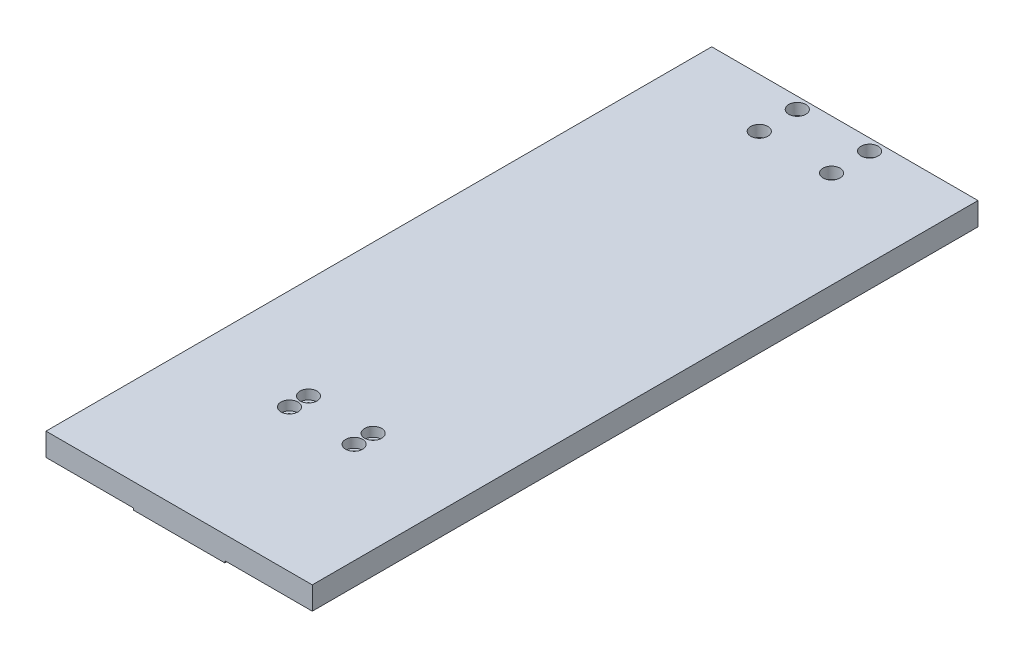
ISO-10303-21;
HEADER;
FILE_DESCRIPTION(('STEP AP214'),'2;1');
FILE_NAME('part.step','',(''),(''),'','','');
FILE_SCHEMA(('AUTOMOTIVE_DESIGN { 1 0 10303 214 1 1 1 1 }'));
ENDSEC;
DATA;
#1=APPLICATION_CONTEXT('core data for automotive mechanical design processes');
#2=APPLICATION_PROTOCOL_DEFINITION('international standard','automotive_design',2000,#1);
#3=PRODUCT_CONTEXT('',#1,'mechanical');
#4=PRODUCT('Part','Part','',(#3));
#5=PRODUCT_RELATED_PRODUCT_CATEGORY('part','',(#4));
#6=PRODUCT_DEFINITION_FORMATION('','',#4);
#7=PRODUCT_DEFINITION_CONTEXT('part definition',#1,'design');
#8=PRODUCT_DEFINITION('design','',#6,#7);
#9=PRODUCT_DEFINITION_SHAPE('','',#8);
#10=(LENGTH_UNIT() NAMED_UNIT(*) SI_UNIT(.MILLI.,.METRE.));
#11=(NAMED_UNIT(*) PLANE_ANGLE_UNIT() SI_UNIT($,.RADIAN.));
#12=(NAMED_UNIT(*) SI_UNIT($,.STERADIAN.) SOLID_ANGLE_UNIT());
#13=UNCERTAINTY_MEASURE_WITH_UNIT(LENGTH_MEASURE(1.E-05),#10,'distance_accuracy_value','');
#14=(GEOMETRIC_REPRESENTATION_CONTEXT(3) GLOBAL_UNCERTAINTY_ASSIGNED_CONTEXT((#13)) GLOBAL_UNIT_ASSIGNED_CONTEXT((#10,
#11,#12)) REPRESENTATION_CONTEXT('',''));
#15=CARTESIAN_POINT('',(0.,0.,0.));
#16=DIRECTION('',(0.,0.,1.));
#17=DIRECTION('',(1.,0.,0.));
#18=AXIS2_PLACEMENT_3D('',#15,#16,#17);
#19=CARTESIAN_POINT('',(0.,13.,-350.));
#20=DIRECTION('',(0.,0.,1.));
#21=DIRECTION('',(1.,0.,0.));
#22=AXIS2_PLACEMENT_3D('',#19,#20,#21);
#23=PLANE('',#22);
#24=CARTESIAN_POINT('',(9.99999999999999,6.99999999999999,-350.));
#25=DIRECTION('',(0.,0.,-1.));
#26=DIRECTION('',(-1.,0.,0.));
#27=AXIS2_PLACEMENT_3D('',#24,#25,#26);
#28=CIRCLE('',#27,2.09999999999999);
#29=CARTESIAN_POINT('',(7.9,6.99999999999999,-350.));
#30=VERTEX_POINT('',#29);
#31=EDGE_CURVE('E326',#30,#30,#28,.T.);
#32=ORIENTED_EDGE('',*,*,#31,.F.);
#33=EDGE_LOOP('',(#32));
#34=FACE_BOUND('',#33,.T.);
#35=CARTESIAN_POINT('',(35.,6.99999999999999,-350.));
#36=DIRECTION('',(0.,0.,-1.));
#37=DIRECTION('',(-1.,0.,0.));
#38=AXIS2_PLACEMENT_3D('',#35,#36,#37);
#39=CIRCLE('',#38,2.09999999999999);
#40=CARTESIAN_POINT('',(32.9,6.99999999999999,-350.));
#41=VERTEX_POINT('',#40);
#42=EDGE_CURVE('E320',#41,#41,#39,.T.);
#43=ORIENTED_EDGE('',*,*,#42,.F.);
#44=EDGE_LOOP('',(#43));
#45=FACE_BOUND('',#44,.T.);
#46=CARTESIAN_POINT('',(105.,6.99999999999999,-350.));
#47=DIRECTION('',(0.,0.,-1.));
#48=DIRECTION('',(-1.,0.,0.));
#49=AXIS2_PLACEMENT_3D('',#46,#47,#48);
#50=CIRCLE('',#49,2.09999999999999);
#51=CARTESIAN_POINT('',(102.9,6.99999999999999,-350.));
#52=VERTEX_POINT('',#51);
#53=EDGE_CURVE('E314',#52,#52,#50,.T.);
#54=ORIENTED_EDGE('',*,*,#53,.F.);
#55=EDGE_LOOP('',(#54));
#56=FACE_BOUND('',#55,.T.);
#57=CARTESIAN_POINT('',(130.,6.99999999999998,-350.));
#58=DIRECTION('',(0.,0.,-1.));
#59=DIRECTION('',(-1.,0.,0.));
#60=AXIS2_PLACEMENT_3D('',#57,#58,#59);
#61=CIRCLE('',#60,2.09999999999999);
#62=CARTESIAN_POINT('',(127.9,6.99999999999998,-350.));
#63=VERTEX_POINT('',#62);
#64=EDGE_CURVE('E301',#63,#63,#61,.T.);
#65=ORIENTED_EDGE('',*,*,#64,.F.);
#66=EDGE_LOOP('',(#65));
#67=FACE_BOUND('',#66,.T.);
#68=DIRECTION('',(0.,-1.,0.));
#69=VECTOR('',#68,1.);
#70=CARTESIAN_POINT('',(140.,13.,-350.));
#71=LINE('',#70,#69);
#72=CARTESIAN_POINT('',(140.,13.,-350.));
#73=VERTEX_POINT('',#72);
#74=CARTESIAN_POINT('',(140.,1.,-350.));
#75=VERTEX_POINT('',#74);
#76=EDGE_CURVE('E197',#73,#75,#71,.T.);
#77=ORIENTED_EDGE('',*,*,#76,.T.);
#78=DIRECTION('',(1.,0.,0.));
#79=VECTOR('',#78,1.);
#80=CARTESIAN_POINT('',(0.,1.,-350.));
#81=LINE('',#80,#79);
#82=CARTESIAN_POINT('',(0.,1.,-350.));
#83=VERTEX_POINT('',#82);
#84=EDGE_CURVE('E170',#83,#75,#81,.T.);
#85=ORIENTED_EDGE('',*,*,#84,.F.);
#86=DIRECTION('',(0.,-1.,0.));
#87=VECTOR('',#86,1.);
#88=CARTESIAN_POINT('',(0.,13.,-350.));
#89=LINE('',#88,#87);
#90=CARTESIAN_POINT('',(0.,13.,-350.));
#91=VERTEX_POINT('',#90);
#92=EDGE_CURVE('E192',#91,#83,#89,.T.);
#93=ORIENTED_EDGE('',*,*,#92,.F.);
#94=DIRECTION('',(-1.,0.,0.));
#95=VECTOR('',#94,1.);
#96=CARTESIAN_POINT('',(0.,13.,-350.));
#97=LINE('',#96,#95);
#98=EDGE_CURVE('E190',#73,#91,#97,.T.);
#99=ORIENTED_EDGE('',*,*,#98,.F.);
#100=EDGE_LOOP('',(#77,#85,#93,#99));
#101=FACE_BOUND('',#100,.T.);
#102=ADVANCED_FACE('F33',(#34,#45,#56,#67,#101),#23,.F.);
#103=CARTESIAN_POINT('',(0.,0.,-350.));
#104=DIRECTION('',(0.,-1.,0.));
#105=DIRECTION('',(0.,0.,-1.));
#106=AXIS2_PLACEMENT_3D('',#103,#104,#105);
#107=PLANE('',#106);
#108=DIRECTION('',(-1.,0.,0.));
#109=VECTOR('',#108,1.);
#110=CARTESIAN_POINT('',(94.,0.,-310.));
#111=LINE('',#110,#109);
#112=CARTESIAN_POINT('',(94.,0.,-310.));
#113=VERTEX_POINT('',#112);
#114=CARTESIAN_POINT('',(46.,0.,-310.));
#115=VERTEX_POINT('',#114);
#116=EDGE_CURVE('E140',#113,#115,#111,.T.);
#117=ORIENTED_EDGE('',*,*,#116,.F.);
#118=DIRECTION('',(0.,0.,-1.));
#119=VECTOR('',#118,1.);
#120=CARTESIAN_POINT('',(94.,0.,-350.));
#121=LINE('',#120,#119);
#122=CARTESIAN_POINT('',(94.,0.,-100.));
#123=VERTEX_POINT('',#122);
#124=EDGE_CURVE('E149',#123,#113,#121,.T.);
#125=ORIENTED_EDGE('',*,*,#124,.F.);
#126=DIRECTION('',(1.,0.,0.));
#127=VECTOR('',#126,1.);
#128=CARTESIAN_POINT('',(94.,0.,-100.));
#129=LINE('',#128,#127);
#130=CARTESIAN_POINT('',(46.,0.,-100.));
#131=VERTEX_POINT('',#130);
#132=EDGE_CURVE('E294',#131,#123,#129,.T.);
#133=ORIENTED_EDGE('',*,*,#132,.F.);
#134=DIRECTION('',(0.,0.,1.));
#135=VECTOR('',#134,1.);
#136=CARTESIAN_POINT('',(46.,0.,-350.));
#137=LINE('',#136,#135);
#138=EDGE_CURVE('E171',#115,#131,#137,.T.);
#139=ORIENTED_EDGE('',*,*,#138,.F.);
#140=EDGE_LOOP('',(#117,#125,#133,#139));
#141=FACE_BOUND('',#140,.T.);
#142=ADVANCED_FACE('F353',(#141),#107,.T.);
#143=CARTESIAN_POINT('',(46.,1.,-350.));
#144=DIRECTION('',(1.,0.,0.));
#145=DIRECTION('',(0.,0.,-1.));
#146=AXIS2_PLACEMENT_3D('',#143,#144,#145);
#147=PLANE('',#146);
#148=DIRECTION('',(0.,0.,1.));
#149=VECTOR('',#148,1.);
#150=CARTESIAN_POINT('',(46.,1.,-350.));
#151=LINE('',#150,#149);
#152=CARTESIAN_POINT('',(46.,1.,-310.));
#153=VERTEX_POINT('',#152);
#154=CARTESIAN_POINT('',(46.,1.,-100.));
#155=VERTEX_POINT('',#154);
#156=EDGE_CURVE('E174',#153,#155,#151,.T.);
#157=ORIENTED_EDGE('',*,*,#156,.F.);
#158=DIRECTION('',(0.,-1.,0.));
#159=VECTOR('',#158,1.);
#160=CARTESIAN_POINT('',(46.,1.,-310.));
#161=LINE('',#160,#159);
#162=EDGE_CURVE('E138',#153,#115,#161,.T.);
#163=ORIENTED_EDGE('',*,*,#162,.T.);
#164=ORIENTED_EDGE('',*,*,#138,.T.);
#165=DIRECTION('',(0.,-1.,0.));
#166=VECTOR('',#165,1.);
#167=CARTESIAN_POINT('',(46.,1.,-100.));
#168=LINE('',#167,#166);
#169=EDGE_CURVE('E302',#155,#131,#168,.T.);
#170=ORIENTED_EDGE('',*,*,#169,.F.);
#171=EDGE_LOOP('',(#157,#163,#164,#170));
#172=FACE_BOUND('',#171,.T.);
#173=ADVANCED_FACE('F359',(#172),#147,.F.);
#174=CARTESIAN_POINT('',(94.,1.,-350.));
#175=DIRECTION('',(-1.,0.,0.));
#176=DIRECTION('',(0.,0.,1.));
#177=AXIS2_PLACEMENT_3D('',#174,#175,#176);
#178=PLANE('',#177);
#179=ORIENTED_EDGE('',*,*,#124,.T.);
#180=DIRECTION('',(0.,-1.,0.));
#181=VECTOR('',#180,1.);
#182=CARTESIAN_POINT('',(94.,1.,-310.));
#183=LINE('',#182,#181);
#184=CARTESIAN_POINT('',(94.,1.,-310.));
#185=VERTEX_POINT('',#184);
#186=EDGE_CURVE('E135',#185,#113,#183,.T.);
#187=ORIENTED_EDGE('',*,*,#186,.F.);
#188=DIRECTION('',(0.,0.,-1.));
#189=VECTOR('',#188,1.);
#190=CARTESIAN_POINT('',(94.,1.,-350.));
#191=LINE('',#190,#189);
#192=CARTESIAN_POINT('',(94.,1.,-100.));
#193=VERTEX_POINT('',#192);
#194=EDGE_CURVE('E147',#193,#185,#191,.T.);
#195=ORIENTED_EDGE('',*,*,#194,.F.);
#196=DIRECTION('',(0.,-1.,0.));
#197=VECTOR('',#196,1.);
#198=CARTESIAN_POINT('',(94.,1.,-100.));
#199=LINE('',#198,#197);
#200=EDGE_CURVE('E299',#193,#123,#199,.T.);
#201=ORIENTED_EDGE('',*,*,#200,.T.);
#202=EDGE_LOOP('',(#179,#187,#195,#201));
#203=FACE_BOUND('',#202,.T.);
#204=ADVANCED_FACE('F145',(#203),#178,.F.);
#205=CARTESIAN_POINT('',(140.,13.,0.));
#206=DIRECTION('',(-1.,0.,0.));
#207=DIRECTION('',(0.,0.,1.));
#208=AXIS2_PLACEMENT_3D('',#205,#206,#207);
#209=PLANE('',#208);
#210=DIRECTION('',(0.,0.,1.));
#211=VECTOR('',#210,1.);
#212=CARTESIAN_POINT('',(140.,1.,-350.));
#213=LINE('',#212,#211);
#214=CARTESIAN_POINT('',(140.,1.,0.));
#215=VERTEX_POINT('',#214);
#216=EDGE_CURVE('E159',#75,#215,#213,.T.);
#217=ORIENTED_EDGE('',*,*,#216,.F.);
#218=ORIENTED_EDGE('',*,*,#76,.F.);
#219=DIRECTION('',(0.,0.,-1.));
#220=VECTOR('',#219,1.);
#221=CARTESIAN_POINT('',(140.,13.,0.));
#222=LINE('',#221,#220);
#223=CARTESIAN_POINT('',(140.,13.,0.));
#224=VERTEX_POINT('',#223);
#225=EDGE_CURVE('E188',#224,#73,#222,.T.);
#226=ORIENTED_EDGE('',*,*,#225,.F.);
#227=DIRECTION('',(0.,-1.,0.));
#228=VECTOR('',#227,1.);
#229=CARTESIAN_POINT('',(140.,13.,0.));
#230=LINE('',#229,#228);
#231=EDGE_CURVE('E42',#224,#215,#230,.T.);
#232=ORIENTED_EDGE('',*,*,#231,.T.);
#233=EDGE_LOOP('',(#217,#218,#226,#232));
#234=FACE_BOUND('',#233,.T.);
#235=ADVANCED_FACE('F341',(#234),#209,.F.);
#236=CARTESIAN_POINT('',(0.,13.,0.));
#237=DIRECTION('',(1.,0.,0.));
#238=DIRECTION('',(0.,0.,-1.));
#239=AXIS2_PLACEMENT_3D('',#236,#237,#238);
#240=PLANE('',#239);
#241=ORIENTED_EDGE('',*,*,#92,.T.);
#242=DIRECTION('',(0.,0.,-1.));
#243=VECTOR('',#242,1.);
#244=CARTESIAN_POINT('',(0.,1.,-350.));
#245=LINE('',#244,#243);
#246=CARTESIAN_POINT('',(0.,1.,0.));
#247=VERTEX_POINT('',#246);
#248=EDGE_CURVE('E168',#247,#83,#245,.T.);
#249=ORIENTED_EDGE('',*,*,#248,.F.);
#250=DIRECTION('',(0.,-1.,0.));
#251=VECTOR('',#250,1.);
#252=CARTESIAN_POINT('',(0.,13.,0.));
#253=LINE('',#252,#251);
#254=CARTESIAN_POINT('',(0.,13.,0.));
#255=VERTEX_POINT('',#254);
#256=EDGE_CURVE('E11',#255,#247,#253,.T.);
#257=ORIENTED_EDGE('',*,*,#256,.F.);
#258=DIRECTION('',(0.,0.,1.));
#259=VECTOR('',#258,1.);
#260=CARTESIAN_POINT('',(0.,13.,0.));
#261=LINE('',#260,#259);
#262=EDGE_CURVE('E183',#91,#255,#261,.T.);
#263=ORIENTED_EDGE('',*,*,#262,.F.);
#264=EDGE_LOOP('',(#241,#249,#257,#263));
#265=FACE_BOUND('',#264,.T.);
#266=ADVANCED_FACE('F35',(#265),#240,.F.);
#267=CARTESIAN_POINT('',(0.,13.,0.));
#268=DIRECTION('',(0.,0.,-1.));
#269=DIRECTION('',(-1.,0.,0.));
#270=AXIS2_PLACEMENT_3D('',#267,#268,#269);
#271=PLANE('',#270);
#272=DIRECTION('',(1.,0.,0.));
#273=VECTOR('',#272,1.);
#274=CARTESIAN_POINT('',(0.,0.,0.));
#275=LINE('',#274,#273);
#276=CARTESIAN_POINT('',(46.,0.,0.));
#277=VERTEX_POINT('',#276);
#278=CARTESIAN_POINT('',(94.,0.,0.));
#279=VERTEX_POINT('',#278);
#280=EDGE_CURVE('E182',#277,#279,#275,.T.);
#281=ORIENTED_EDGE('',*,*,#280,.T.);
#282=DIRECTION('',(0.,-1.,0.));
#283=VECTOR('',#282,1.);
#284=CARTESIAN_POINT('',(94.,1.,0.));
#285=LINE('',#284,#283);
#286=CARTESIAN_POINT('',(94.,1.,0.));
#287=VERTEX_POINT('',#286);
#288=EDGE_CURVE('E157',#287,#279,#285,.T.);
#289=ORIENTED_EDGE('',*,*,#288,.F.);
#290=DIRECTION('',(-1.,0.,0.));
#291=VECTOR('',#290,1.);
#292=CARTESIAN_POINT('',(140.,1.,0.));
#293=LINE('',#292,#291);
#294=EDGE_CURVE('E154',#215,#287,#293,.T.);
#295=ORIENTED_EDGE('',*,*,#294,.F.);
#296=ORIENTED_EDGE('',*,*,#231,.F.);
#297=DIRECTION('',(1.,0.,0.));
#298=VECTOR('',#297,1.);
#299=CARTESIAN_POINT('',(0.,13.,0.));
#300=LINE('',#299,#298);
#301=EDGE_CURVE('E186',#255,#224,#300,.T.);
#302=ORIENTED_EDGE('',*,*,#301,.F.);
#303=ORIENTED_EDGE('',*,*,#256,.T.);
#304=DIRECTION('',(-1.,0.,0.));
#305=VECTOR('',#304,1.);
#306=CARTESIAN_POINT('',(0.,1.,0.));
#307=LINE('',#306,#305);
#308=CARTESIAN_POINT('',(46.,1.,0.));
#309=VERTEX_POINT('',#308);
#310=EDGE_CURVE('E176',#309,#247,#307,.T.);
#311=ORIENTED_EDGE('',*,*,#310,.F.);
#312=DIRECTION('',(0.,-1.,0.));
#313=VECTOR('',#312,1.);
#314=CARTESIAN_POINT('',(46.,1.,0.));
#315=LINE('',#314,#313);
#316=EDGE_CURVE('E178',#309,#277,#315,.T.);
#317=ORIENTED_EDGE('',*,*,#316,.T.);
#318=EDGE_LOOP('',(#281,#289,#295,#296,#302,#303,#311,#317));
#319=FACE_BOUND('',#318,.T.);
#320=ADVANCED_FACE('F339',(#319),#271,.F.);
#321=CARTESIAN_POINT('',(0.,13.,-350.));
#322=DIRECTION('',(0.,-1.,0.));
#323=DIRECTION('',(0.,0.,-1.));
#324=AXIS2_PLACEMENT_3D('',#321,#322,#323);
#325=PLANE('',#324);
#326=CARTESIAN_POINT('',(53.,13.,-85.));
#327=DIRECTION('',(0.,1.,0.));
#328=DIRECTION('',(0.,0.,1.));
#329=AXIS2_PLACEMENT_3D('',#326,#327,#328);
#330=CIRCLE('',#329,4.49999999999999);
#331=CARTESIAN_POINT('',(53.,13.,-80.5));
#332=VERTEX_POINT('',#331);
#333=EDGE_CURVE('E806',#332,#332,#330,.T.);
#334=ORIENTED_EDGE('',*,*,#333,.F.);
#335=EDGE_LOOP('',(#334));
#336=FACE_BOUND('',#335,.T.);
#337=CARTESIAN_POINT('',(87.,13.,-85.));
#338=DIRECTION('',(0.,1.,0.));
#339=DIRECTION('',(0.,0.,1.));
#340=AXIS2_PLACEMENT_3D('',#337,#338,#339);
#341=CIRCLE('',#340,4.49999999999999);
#342=CARTESIAN_POINT('',(87.,13.,-80.5));
#343=VERTEX_POINT('',#342);
#344=EDGE_CURVE('E245',#343,#343,#341,.T.);
#345=ORIENTED_EDGE('',*,*,#344,.F.);
#346=EDGE_LOOP('',(#345));
#347=FACE_BOUND('',#346,.T.);
#348=CARTESIAN_POINT('',(53.,13.,-75.));
#349=DIRECTION('',(0.,1.,0.));
#350=DIRECTION('',(0.,0.,1.));
#351=AXIS2_PLACEMENT_3D('',#348,#349,#350);
#352=CIRCLE('',#351,4.49999999999999);
#353=CARTESIAN_POINT('',(53.,13.,-70.5));
#354=VERTEX_POINT('',#353);
#355=EDGE_CURVE('E232',#354,#354,#352,.T.);
#356=ORIENTED_EDGE('',*,*,#355,.F.);
#357=EDGE_LOOP('',(#356));
#358=FACE_BOUND('',#357,.T.);
#359=CARTESIAN_POINT('',(87.,13.,-75.));
#360=DIRECTION('',(0.,1.,0.));
#361=DIRECTION('',(0.,0.,1.));
#362=AXIS2_PLACEMENT_3D('',#359,#360,#361);
#363=CIRCLE('',#362,4.49999999999999);
#364=CARTESIAN_POINT('',(87.,13.,-70.5));
#365=VERTEX_POINT('',#364);
#366=EDGE_CURVE('E228',#365,#365,#363,.T.);
#367=ORIENTED_EDGE('',*,*,#366,.F.);
#368=EDGE_LOOP('',(#367));
#369=FACE_BOUND('',#368,.T.);
#370=CARTESIAN_POINT('',(51.0000000000001,13.,-344.));
#371=DIRECTION('',(0.,1.,0.));
#372=DIRECTION('',(0.,0.,1.));
#373=AXIS2_PLACEMENT_3D('',#370,#371,#372);
#374=CIRCLE('',#373,4.5);
#375=CARTESIAN_POINT('',(51.0000000000001,13.,-339.5));
#376=VERTEX_POINT('',#375);
#377=EDGE_CURVE('E224',#376,#376,#374,.T.);
#378=ORIENTED_EDGE('',*,*,#377,.F.);
#379=EDGE_LOOP('',(#378));
#380=FACE_BOUND('',#379,.T.);
#381=CARTESIAN_POINT('',(89.0000000000001,13.,-344.));
#382=DIRECTION('',(0.,1.,0.));
#383=DIRECTION('',(0.,0.,1.));
#384=AXIS2_PLACEMENT_3D('',#381,#382,#383);
#385=CIRCLE('',#384,4.49999999999999);
#386=CARTESIAN_POINT('',(89.0000000000001,13.,-339.5));
#387=VERTEX_POINT('',#386);
#388=EDGE_CURVE('E219',#387,#387,#385,.T.);
#389=ORIENTED_EDGE('',*,*,#388,.F.);
#390=EDGE_LOOP('',(#389));
#391=FACE_BOUND('',#390,.T.);
#392=CARTESIAN_POINT('',(51.0000000000001,13.,-324.));
#393=DIRECTION('',(0.,1.,0.));
#394=DIRECTION('',(0.,0.,1.));
#395=AXIS2_PLACEMENT_3D('',#392,#393,#394);
#396=CIRCLE('',#395,4.5);
#397=CARTESIAN_POINT('',(51.0000000000001,13.,-319.5));
#398=VERTEX_POINT('',#397);
#399=EDGE_CURVE('E214',#398,#398,#396,.T.);
#400=ORIENTED_EDGE('',*,*,#399,.F.);
#401=EDGE_LOOP('',(#400));
#402=FACE_BOUND('',#401,.T.);
#403=CARTESIAN_POINT('',(89.0000000000001,13.,-324.));
#404=DIRECTION('',(0.,1.,0.));
#405=DIRECTION('',(0.,0.,1.));
#406=AXIS2_PLACEMENT_3D('',#403,#404,#405);
#407=CIRCLE('',#406,4.49999999999999);
#408=CARTESIAN_POINT('',(89.0000000000001,13.,-319.5));
#409=VERTEX_POINT('',#408);
#410=EDGE_CURVE('E209',#409,#409,#407,.T.);
#411=ORIENTED_EDGE('',*,*,#410,.F.);
#412=EDGE_LOOP('',(#411));
#413=FACE_BOUND('',#412,.T.);
#414=ORIENTED_EDGE('',*,*,#262,.T.);
#415=ORIENTED_EDGE('',*,*,#301,.T.);
#416=ORIENTED_EDGE('',*,*,#225,.T.);
#417=ORIENTED_EDGE('',*,*,#98,.T.);
#418=EDGE_LOOP('',(#414,#415,#416,#417));
#419=FACE_BOUND('',#418,.T.);
#420=ADVANCED_FACE('F344',(#336,#347,#358,#369,#380,#391,#402,#413,#419),#325,.F.);
#421=DIRECTION('',(-1.,0.,0.));
#422=VECTOR('',#421,1.);
#423=CARTESIAN_POINT('',(94.,0.,-60.));
#424=LINE('',#423,#422);
#425=CARTESIAN_POINT('',(94.,0.,-60.));
#426=VERTEX_POINT('',#425);
#427=CARTESIAN_POINT('',(46.,0.,-60.));
#428=VERTEX_POINT('',#427);
#429=EDGE_CURVE('E289',#426,#428,#424,.T.);
#430=ORIENTED_EDGE('',*,*,#429,.F.);
#431=EDGE_CURVE('E163',#279,#426,#121,.T.);
#432=ORIENTED_EDGE('',*,*,#431,.F.);
#433=ORIENTED_EDGE('',*,*,#280,.F.);
#434=EDGE_CURVE('E167',#428,#277,#137,.T.);
#435=ORIENTED_EDGE('',*,*,#434,.F.);
#436=EDGE_LOOP('',(#430,#432,#433,#435));
#437=FACE_BOUND('',#436,.T.);
#438=ADVANCED_FACE('F362',(#437),#107,.T.);
#439=CARTESIAN_POINT('',(46.,1.,-60.));
#440=VERTEX_POINT('',#439);
#441=EDGE_CURVE('E173',#440,#309,#151,.T.);
#442=ORIENTED_EDGE('',*,*,#441,.F.);
#443=DIRECTION('',(0.,-1.,0.));
#444=VECTOR('',#443,1.);
#445=CARTESIAN_POINT('',(46.,1.,-60.));
#446=LINE('',#445,#444);
#447=EDGE_CURVE('E305',#440,#428,#446,.T.);
#448=ORIENTED_EDGE('',*,*,#447,.T.);
#449=ORIENTED_EDGE('',*,*,#434,.T.);
#450=ORIENTED_EDGE('',*,*,#316,.F.);
#451=EDGE_LOOP('',(#442,#448,#449,#450));
#452=FACE_BOUND('',#451,.T.);
#453=ADVANCED_FACE('F395',(#452),#147,.F.);
#454=CARTESIAN_POINT('',(0.,1.,0.));
#455=DIRECTION('',(0.,1.,0.));
#456=DIRECTION('',(0.,0.,1.));
#457=AXIS2_PLACEMENT_3D('',#454,#455,#456);
#458=PLANE('',#457);
#459=CARTESIAN_POINT('',(53.,0.999999999999999,-85.));
#460=DIRECTION('',(0.,1.,0.));
#461=DIRECTION('',(0.,0.,1.));
#462=AXIS2_PLACEMENT_3D('',#459,#460,#461);
#463=CIRCLE('',#462,2.75);
#464=CARTESIAN_POINT('',(53.,0.999999999999999,-82.25));
#465=VERTEX_POINT('',#464);
#466=EDGE_CURVE('E37',#465,#465,#463,.T.);
#467=ORIENTED_EDGE('',*,*,#466,.T.);
#468=EDGE_LOOP('',(#467));
#469=FACE_BOUND('',#468,.T.);
#470=CARTESIAN_POINT('',(87.,0.999999999999999,-85.));
#471=DIRECTION('',(0.,1.,0.));
#472=DIRECTION('',(0.,0.,1.));
#473=AXIS2_PLACEMENT_3D('',#470,#471,#472);
#474=CIRCLE('',#473,2.75);
#475=CARTESIAN_POINT('',(87.,0.999999999999999,-82.25));
#476=VERTEX_POINT('',#475);
#477=EDGE_CURVE('E230',#476,#476,#474,.T.);
#478=ORIENTED_EDGE('',*,*,#477,.T.);
#479=EDGE_LOOP('',(#478));
#480=FACE_BOUND('',#479,.T.);
#481=CARTESIAN_POINT('',(53.,0.999999999999999,-75.));
#482=DIRECTION('',(0.,1.,0.));
#483=DIRECTION('',(0.,0.,1.));
#484=AXIS2_PLACEMENT_3D('',#481,#482,#483);
#485=CIRCLE('',#484,2.75);
#486=CARTESIAN_POINT('',(53.,0.999999999999999,-72.25));
#487=VERTEX_POINT('',#486);
#488=EDGE_CURVE('E226',#487,#487,#485,.T.);
#489=ORIENTED_EDGE('',*,*,#488,.T.);
#490=EDGE_LOOP('',(#489));
#491=FACE_BOUND('',#490,.T.);
#492=CARTESIAN_POINT('',(87.,0.999999999999999,-75.));
#493=DIRECTION('',(0.,1.,0.));
#494=DIRECTION('',(0.,0.,1.));
#495=AXIS2_PLACEMENT_3D('',#492,#493,#494);
#496=CIRCLE('',#495,2.75);
#497=CARTESIAN_POINT('',(87.,0.999999999999999,-72.25));
#498=VERTEX_POINT('',#497);
#499=EDGE_CURVE('E221',#498,#498,#496,.T.);
#500=ORIENTED_EDGE('',*,*,#499,.T.);
#501=EDGE_LOOP('',(#500));
#502=FACE_BOUND('',#501,.T.);
#503=CARTESIAN_POINT('',(51.0000000000001,0.999999999999999,-344.));
#504=DIRECTION('',(0.,1.,0.));
#505=DIRECTION('',(0.,0.,1.));
#506=AXIS2_PLACEMENT_3D('',#503,#504,#505);
#507=CIRCLE('',#506,2.75);
#508=CARTESIAN_POINT('',(51.0000000000001,0.999999999999999,-341.25));
#509=VERTEX_POINT('',#508);
#510=EDGE_CURVE('E216',#509,#509,#507,.T.);
#511=ORIENTED_EDGE('',*,*,#510,.T.);
#512=EDGE_LOOP('',(#511));
#513=FACE_BOUND('',#512,.T.);
#514=CARTESIAN_POINT('',(89.0000000000001,0.999999999999999,-344.));
#515=DIRECTION('',(0.,1.,0.));
#516=DIRECTION('',(0.,0.,1.));
#517=AXIS2_PLACEMENT_3D('',#514,#515,#516);
#518=CIRCLE('',#517,2.75);
#519=CARTESIAN_POINT('',(89.0000000000001,0.999999999999999,-341.25));
#520=VERTEX_POINT('',#519);
#521=EDGE_CURVE('E211',#520,#520,#518,.T.);
#522=ORIENTED_EDGE('',*,*,#521,.T.);
#523=EDGE_LOOP('',(#522));
#524=FACE_BOUND('',#523,.T.);
#525=CARTESIAN_POINT('',(51.0000000000001,0.999999999999999,-324.));
#526=DIRECTION('',(0.,1.,0.));
#527=DIRECTION('',(0.,0.,1.));
#528=AXIS2_PLACEMENT_3D('',#525,#526,#527);
#529=CIRCLE('',#528,2.75);
#530=CARTESIAN_POINT('',(51.0000000000001,0.999999999999999,-321.25));
#531=VERTEX_POINT('',#530);
#532=EDGE_CURVE('E206',#531,#531,#529,.T.);
#533=ORIENTED_EDGE('',*,*,#532,.T.);
#534=EDGE_LOOP('',(#533));
#535=FACE_BOUND('',#534,.T.);
#536=CARTESIAN_POINT('',(89.0000000000001,0.999999999999999,-324.));
#537=DIRECTION('',(0.,1.,0.));
#538=DIRECTION('',(0.,0.,1.));
#539=AXIS2_PLACEMENT_3D('',#536,#537,#538);
#540=CIRCLE('',#539,2.75);
#541=CARTESIAN_POINT('',(89.0000000000001,0.999999999999999,-321.25));
#542=VERTEX_POINT('',#541);
#543=EDGE_CURVE('E202',#542,#542,#540,.T.);
#544=ORIENTED_EDGE('',*,*,#543,.T.);
#545=EDGE_LOOP('',(#544));
#546=FACE_BOUND('',#545,.T.);
#547=ORIENTED_EDGE('',*,*,#194,.T.);
#548=DIRECTION('',(-1.,0.,0.));
#549=VECTOR('',#548,1.);
#550=CARTESIAN_POINT('',(94.,1.,-310.));
#551=LINE('',#550,#549);
#552=EDGE_CURVE('E50',#185,#153,#551,.T.);
#553=ORIENTED_EDGE('',*,*,#552,.T.);
#554=ORIENTED_EDGE('',*,*,#156,.T.);
#555=DIRECTION('',(1.,0.,0.));
#556=VECTOR('',#555,1.);
#557=CARTESIAN_POINT('',(94.,1.,-100.));
#558=LINE('',#557,#556);
#559=EDGE_CURVE('E55',#155,#193,#558,.T.);
#560=ORIENTED_EDGE('',*,*,#559,.T.);
#561=EDGE_LOOP('',(#547,#553,#554,#560));
#562=FACE_BOUND('',#561,.T.);
#563=ORIENTED_EDGE('',*,*,#248,.T.);
#564=ORIENTED_EDGE('',*,*,#84,.T.);
#565=ORIENTED_EDGE('',*,*,#216,.T.);
#566=ORIENTED_EDGE('',*,*,#294,.T.);
#567=CARTESIAN_POINT('',(94.,1.,-60.));
#568=VERTEX_POINT('',#567);
#569=EDGE_CURVE('E153',#287,#568,#191,.T.);
#570=ORIENTED_EDGE('',*,*,#569,.T.);
#571=DIRECTION('',(-1.,0.,0.));
#572=VECTOR('',#571,1.);
#573=CARTESIAN_POINT('',(94.,1.,-60.));
#574=LINE('',#573,#572);
#575=EDGE_CURVE('E291',#568,#440,#574,.T.);
#576=ORIENTED_EDGE('',*,*,#575,.T.);
#577=ORIENTED_EDGE('',*,*,#441,.T.);
#578=ORIENTED_EDGE('',*,*,#310,.T.);
#579=EDGE_LOOP('',(#563,#564,#565,#566,#570,#576,#577,#578));
#580=FACE_BOUND('',#579,.T.);
#581=ADVANCED_FACE('F151',(#469,#480,#491,#502,#513,#524,#535,#546,#562,#580),#458,.F.);
#582=ORIENTED_EDGE('',*,*,#431,.T.);
#583=DIRECTION('',(0.,-1.,0.));
#584=VECTOR('',#583,1.);
#585=CARTESIAN_POINT('',(94.,1.,-60.));
#586=LINE('',#585,#584);
#587=EDGE_CURVE('E296',#568,#426,#586,.T.);
#588=ORIENTED_EDGE('',*,*,#587,.F.);
#589=ORIENTED_EDGE('',*,*,#569,.F.);
#590=ORIENTED_EDGE('',*,*,#288,.T.);
#591=EDGE_LOOP('',(#582,#588,#589,#590));
#592=FACE_BOUND('',#591,.T.);
#593=ADVANCED_FACE('F387',(#592),#178,.F.);
#594=CARTESIAN_POINT('',(9.99999999999999,6.99999999999999,-315.));
#595=DIRECTION('',(0.,0.,-1.));
#596=DIRECTION('',(-1.,0.,0.));
#597=AXIS2_PLACEMENT_3D('',#594,#595,#596);
#598=CONICAL_SURFACE('',#597,2.09999999999999,1.02974425867666);
#599=CARTESIAN_POINT('',(9.99999999999998,6.99999999999999,-313.738192700042));
#600=VERTEX_POINT('',#599);
#601=VERTEX_LOOP('',#600);
#602=FACE_BOUND('',#601,.T.);
#603=CARTESIAN_POINT('',(9.99999999999999,6.99999999999999,-315.));
#604=DIRECTION('',(0.,0.,-1.));
#605=DIRECTION('',(-1.,0.,0.));
#606=AXIS2_PLACEMENT_3D('',#603,#604,#605);
#607=CIRCLE('',#606,2.09999999999999);
#608=CARTESIAN_POINT('',(7.9,6.99999999999999,-315.));
#609=VERTEX_POINT('',#608);
#610=EDGE_CURVE('E329',#609,#609,#607,.T.);
#611=ORIENTED_EDGE('',*,*,#610,.T.);
#612=EDGE_LOOP('',(#611));
#613=FACE_BOUND('',#612,.T.);
#614=ADVANCED_FACE('F478',(#602,#613),#598,.F.);
#615=CARTESIAN_POINT('',(9.99999999999999,6.99999999999999,-350.));
#616=DIRECTION('',(0.,0.,-1.));
#617=DIRECTION('',(-1.,0.,0.));
#618=AXIS2_PLACEMENT_3D('',#615,#616,#617);
#619=CYLINDRICAL_SURFACE('',#618,2.09999999999999);
#620=ORIENTED_EDGE('',*,*,#610,.F.);
#621=EDGE_LOOP('',(#620));
#622=FACE_BOUND('',#621,.T.);
#623=ORIENTED_EDGE('',*,*,#31,.T.);
#624=EDGE_LOOP('',(#623));
#625=FACE_BOUND('',#624,.T.);
#626=ADVANCED_FACE('F468',(#622,#625),#619,.F.);
#627=CARTESIAN_POINT('',(35.,6.99999999999999,-315.));
#628=DIRECTION('',(0.,0.,-1.));
#629=DIRECTION('',(-1.,0.,0.));
#630=AXIS2_PLACEMENT_3D('',#627,#628,#629);
#631=CONICAL_SURFACE('',#630,2.09999999999999,1.02974425867666);
#632=CARTESIAN_POINT('',(35.,6.99999999999999,-313.738192700042));
#633=VERTEX_POINT('',#632);
#634=VERTEX_LOOP('',#633);
#635=FACE_BOUND('',#634,.T.);
#636=CARTESIAN_POINT('',(35.,6.99999999999999,-315.));
#637=DIRECTION('',(0.,0.,-1.));
#638=DIRECTION('',(-1.,0.,0.));
#639=AXIS2_PLACEMENT_3D('',#636,#637,#638);
#640=CIRCLE('',#639,2.09999999999999);
#641=CARTESIAN_POINT('',(32.9,6.99999999999999,-315.));
#642=VERTEX_POINT('',#641);
#643=EDGE_CURVE('E323',#642,#642,#640,.T.);
#644=ORIENTED_EDGE('',*,*,#643,.T.);
#645=EDGE_LOOP('',(#644));
#646=FACE_BOUND('',#645,.T.);
#647=ADVANCED_FACE('F458',(#635,#646),#631,.F.);
#648=CARTESIAN_POINT('',(35.,6.99999999999999,-350.));
#649=DIRECTION('',(0.,0.,-1.));
#650=DIRECTION('',(-1.,0.,0.));
#651=AXIS2_PLACEMENT_3D('',#648,#649,#650);
#652=CYLINDRICAL_SURFACE('',#651,2.09999999999999);
#653=ORIENTED_EDGE('',*,*,#643,.F.);
#654=EDGE_LOOP('',(#653));
#655=FACE_BOUND('',#654,.T.);
#656=ORIENTED_EDGE('',*,*,#42,.T.);
#657=EDGE_LOOP('',(#656));
#658=FACE_BOUND('',#657,.T.);
#659=ADVANCED_FACE('F448',(#655,#658),#652,.F.);
#660=CARTESIAN_POINT('',(105.,6.99999999999999,-315.));
#661=DIRECTION('',(0.,0.,-1.));
#662=DIRECTION('',(-1.,0.,0.));
#663=AXIS2_PLACEMENT_3D('',#660,#661,#662);
#664=CONICAL_SURFACE('',#663,2.09999999999999,1.02974425867666);
#665=CARTESIAN_POINT('',(105.,6.99999999999999,-313.738192700042));
#666=VERTEX_POINT('',#665);
#667=VERTEX_LOOP('',#666);
#668=FACE_BOUND('',#667,.T.);
#669=CARTESIAN_POINT('',(105.,6.99999999999999,-315.));
#670=DIRECTION('',(0.,0.,-1.));
#671=DIRECTION('',(-1.,0.,0.));
#672=AXIS2_PLACEMENT_3D('',#669,#670,#671);
#673=CIRCLE('',#672,2.09999999999999);
#674=CARTESIAN_POINT('',(102.9,6.99999999999999,-315.));
#675=VERTEX_POINT('',#674);
#676=EDGE_CURVE('E317',#675,#675,#673,.T.);
#677=ORIENTED_EDGE('',*,*,#676,.T.);
#678=EDGE_LOOP('',(#677));
#679=FACE_BOUND('',#678,.T.);
#680=ADVANCED_FACE('F438',(#668,#679),#664,.F.);
#681=CARTESIAN_POINT('',(105.,6.99999999999999,-350.));
#682=DIRECTION('',(0.,0.,-1.));
#683=DIRECTION('',(-1.,0.,0.));
#684=AXIS2_PLACEMENT_3D('',#681,#682,#683);
#685=CYLINDRICAL_SURFACE('',#684,2.09999999999999);
#686=ORIENTED_EDGE('',*,*,#676,.F.);
#687=EDGE_LOOP('',(#686));
#688=FACE_BOUND('',#687,.T.);
#689=ORIENTED_EDGE('',*,*,#53,.T.);
#690=EDGE_LOOP('',(#689));
#691=FACE_BOUND('',#690,.T.);
#692=ADVANCED_FACE('F428',(#688,#691),#685,.F.);
#693=CARTESIAN_POINT('',(130.,6.99999999999998,-315.));
#694=DIRECTION('',(0.,0.,-1.));
#695=DIRECTION('',(-1.,0.,0.));
#696=AXIS2_PLACEMENT_3D('',#693,#694,#695);
#697=CONICAL_SURFACE('',#696,2.09999999999999,1.02974425867667);
#698=CARTESIAN_POINT('',(130.,6.99999999999998,-313.738192700042));
#699=VERTEX_POINT('',#698);
#700=VERTEX_LOOP('',#699);
#701=FACE_BOUND('',#700,.T.);
#702=CARTESIAN_POINT('',(130.,6.99999999999998,-315.));
#703=DIRECTION('',(0.,0.,-1.));
#704=DIRECTION('',(-1.,0.,0.));
#705=AXIS2_PLACEMENT_3D('',#702,#703,#704);
#706=CIRCLE('',#705,2.09999999999999);
#707=CARTESIAN_POINT('',(127.9,6.99999999999998,-315.));
#708=VERTEX_POINT('',#707);
#709=EDGE_CURVE('E311',#708,#708,#706,.T.);
#710=ORIENTED_EDGE('',*,*,#709,.T.);
#711=EDGE_LOOP('',(#710));
#712=FACE_BOUND('',#711,.T.);
#713=ADVANCED_FACE('F417',(#701,#712),#697,.F.);
#714=CARTESIAN_POINT('',(130.,6.99999999999998,-350.));
#715=DIRECTION('',(0.,0.,-1.));
#716=DIRECTION('',(-1.,0.,0.));
#717=AXIS2_PLACEMENT_3D('',#714,#715,#716);
#718=CYLINDRICAL_SURFACE('',#717,2.09999999999999);
#719=ORIENTED_EDGE('',*,*,#709,.F.);
#720=EDGE_LOOP('',(#719));
#721=FACE_BOUND('',#720,.T.);
#722=ORIENTED_EDGE('',*,*,#64,.T.);
#723=EDGE_LOOP('',(#722));
#724=FACE_BOUND('',#723,.T.);
#725=ADVANCED_FACE('F411',(#721,#724),#718,.F.);
#726=CARTESIAN_POINT('',(94.,1.,-100.));
#727=DIRECTION('',(0.,0.,-1.));
#728=DIRECTION('',(-1.,0.,0.));
#729=AXIS2_PLACEMENT_3D('',#726,#727,#728);
#730=PLANE('',#729);
#731=ORIENTED_EDGE('',*,*,#132,.T.);
#732=ORIENTED_EDGE('',*,*,#200,.F.);
#733=ORIENTED_EDGE('',*,*,#559,.F.);
#734=ORIENTED_EDGE('',*,*,#169,.T.);
#735=EDGE_LOOP('',(#731,#732,#733,#734));
#736=FACE_BOUND('',#735,.T.);
#737=ADVANCED_FACE('F416',(#736),#730,.F.);
#738=CARTESIAN_POINT('',(94.,1.,-60.));
#739=DIRECTION('',(0.,0.,1.));
#740=DIRECTION('',(1.,0.,0.));
#741=AXIS2_PLACEMENT_3D('',#738,#739,#740);
#742=PLANE('',#741);
#743=ORIENTED_EDGE('',*,*,#429,.T.);
#744=ORIENTED_EDGE('',*,*,#447,.F.);
#745=ORIENTED_EDGE('',*,*,#575,.F.);
#746=ORIENTED_EDGE('',*,*,#587,.T.);
#747=EDGE_LOOP('',(#743,#744,#745,#746));
#748=FACE_BOUND('',#747,.T.);
#749=ADVANCED_FACE('F540',(#748),#742,.F.);
#750=CARTESIAN_POINT('',(94.,1.,-310.));
#751=DIRECTION('',(0.,0.,1.));
#752=DIRECTION('',(1.,0.,0.));
#753=AXIS2_PLACEMENT_3D('',#750,#751,#752);
#754=PLANE('',#753);
#755=ORIENTED_EDGE('',*,*,#116,.T.);
#756=ORIENTED_EDGE('',*,*,#162,.F.);
#757=ORIENTED_EDGE('',*,*,#552,.F.);
#758=ORIENTED_EDGE('',*,*,#186,.T.);
#759=EDGE_LOOP('',(#755,#756,#757,#758));
#760=FACE_BOUND('',#759,.T.);
#761=ADVANCED_FACE('F134',(#760),#754,.F.);
#762=CARTESIAN_POINT('',(89.0000000000001,13.,-324.));
#763=DIRECTION('',(0.,1.,0.));
#764=DIRECTION('',(0.,0.,1.));
#765=AXIS2_PLACEMENT_3D('',#762,#763,#764);
#766=CYLINDRICAL_SURFACE('',#765,2.75);
#767=CARTESIAN_POINT('',(89.0000000000001,7.,-324.));
#768=DIRECTION('',(0.,1.,0.));
#769=DIRECTION('',(0.,0.,1.));
#770=AXIS2_PLACEMENT_3D('',#767,#768,#769);
#771=CIRCLE('',#770,2.75);
#772=CARTESIAN_POINT('',(89.0000000000001,7.,-321.25));
#773=VERTEX_POINT('',#772);
#774=EDGE_CURVE('E205',#773,#773,#771,.T.);
#775=ORIENTED_EDGE('',*,*,#774,.T.);
#776=EDGE_LOOP('',(#775));
#777=FACE_BOUND('',#776,.T.);
#778=ORIENTED_EDGE('',*,*,#543,.F.);
#779=EDGE_LOOP('',(#778));
#780=FACE_BOUND('',#779,.T.);
#781=ADVANCED_FACE('F559',(#777,#780),#766,.F.);
#782=CARTESIAN_POINT('',(91.7500000000001,7.,-324.));
#783=DIRECTION('',(0.,-1.,0.));
#784=DIRECTION('',(0.,0.,-1.));
#785=AXIS2_PLACEMENT_3D('',#782,#783,#784);
#786=PLANE('',#785);
#787=ORIENTED_EDGE('',*,*,#774,.F.);
#788=EDGE_LOOP('',(#787));
#789=FACE_BOUND('',#788,.T.);
#790=CARTESIAN_POINT('',(89.0000000000001,7.,-324.));
#791=DIRECTION('',(0.,1.,0.));
#792=DIRECTION('',(0.,0.,1.));
#793=AXIS2_PLACEMENT_3D('',#790,#791,#792);
#794=CIRCLE('',#793,4.49999999999999);
#795=CARTESIAN_POINT('',(89.0000000000001,7.,-319.5));
#796=VERTEX_POINT('',#795);
#797=EDGE_CURVE('E283',#796,#796,#794,.T.);
#798=ORIENTED_EDGE('',*,*,#797,.T.);
#799=EDGE_LOOP('',(#798));
#800=FACE_BOUND('',#799,.T.);
#801=ADVANCED_FACE('F568',(#789,#800),#786,.F.);
#802=CARTESIAN_POINT('',(89.0000000000001,13.,-324.));
#803=DIRECTION('',(0.,1.,0.));
#804=DIRECTION('',(0.,0.,1.));
#805=AXIS2_PLACEMENT_3D('',#802,#803,#804);
#806=CYLINDRICAL_SURFACE('',#805,4.49999999999999);
#807=ORIENTED_EDGE('',*,*,#797,.F.);
#808=EDGE_LOOP('',(#807));
#809=FACE_BOUND('',#808,.T.);
#810=ORIENTED_EDGE('',*,*,#410,.T.);
#811=EDGE_LOOP('',(#810));
#812=FACE_BOUND('',#811,.T.);
#813=ADVANCED_FACE('F578',(#809,#812),#806,.F.);
#814=CARTESIAN_POINT('',(51.0000000000001,13.,-324.));
#815=DIRECTION('',(0.,1.,0.));
#816=DIRECTION('',(0.,0.,1.));
#817=AXIS2_PLACEMENT_3D('',#814,#815,#816);
#818=CYLINDRICAL_SURFACE('',#817,2.75);
#819=CARTESIAN_POINT('',(51.0000000000001,7.,-324.));
#820=DIRECTION('',(0.,1.,0.));
#821=DIRECTION('',(0.,0.,1.));
#822=AXIS2_PLACEMENT_3D('',#819,#820,#821);
#823=CIRCLE('',#822,2.75);
#824=CARTESIAN_POINT('',(51.0000000000001,7.,-321.25));
#825=VERTEX_POINT('',#824);
#826=EDGE_CURVE('E210',#825,#825,#823,.T.);
#827=ORIENTED_EDGE('',*,*,#826,.T.);
#828=EDGE_LOOP('',(#827));
#829=FACE_BOUND('',#828,.T.);
#830=ORIENTED_EDGE('',*,*,#532,.F.);
#831=EDGE_LOOP('',(#830));
#832=FACE_BOUND('',#831,.T.);
#833=ADVANCED_FACE('F588',(#829,#832),#818,.F.);
#834=CARTESIAN_POINT('',(53.7500000000001,7.,-324.));
#835=DIRECTION('',(0.,-1.,0.));
#836=DIRECTION('',(0.,0.,-1.));
#837=AXIS2_PLACEMENT_3D('',#834,#835,#836);
#838=PLANE('',#837);
#839=ORIENTED_EDGE('',*,*,#826,.F.);
#840=EDGE_LOOP('',(#839));
#841=FACE_BOUND('',#840,.T.);
#842=CARTESIAN_POINT('',(51.0000000000001,7.,-324.));
#843=DIRECTION('',(0.,1.,0.));
#844=DIRECTION('',(0.,0.,1.));
#845=AXIS2_PLACEMENT_3D('',#842,#843,#844);
#846=CIRCLE('',#845,4.5);
#847=CARTESIAN_POINT('',(51.0000000000001,7.,-319.5));
#848=VERTEX_POINT('',#847);
#849=EDGE_CURVE('E276',#848,#848,#846,.T.);
#850=ORIENTED_EDGE('',*,*,#849,.T.);
#851=EDGE_LOOP('',(#850));
#852=FACE_BOUND('',#851,.T.);
#853=ADVANCED_FACE('F598',(#841,#852),#838,.F.);
#854=CARTESIAN_POINT('',(51.0000000000001,13.,-324.));
#855=DIRECTION('',(0.,1.,0.));
#856=DIRECTION('',(0.,0.,1.));
#857=AXIS2_PLACEMENT_3D('',#854,#855,#856);
#858=CYLINDRICAL_SURFACE('',#857,4.5);
#859=ORIENTED_EDGE('',*,*,#849,.F.);
#860=EDGE_LOOP('',(#859));
#861=FACE_BOUND('',#860,.T.);
#862=ORIENTED_EDGE('',*,*,#399,.T.);
#863=EDGE_LOOP('',(#862));
#864=FACE_BOUND('',#863,.T.);
#865=ADVANCED_FACE('F608',(#861,#864),#858,.F.);
#866=CARTESIAN_POINT('',(89.0000000000001,13.,-344.));
#867=DIRECTION('',(0.,1.,0.));
#868=DIRECTION('',(0.,0.,1.));
#869=AXIS2_PLACEMENT_3D('',#866,#867,#868);
#870=CYLINDRICAL_SURFACE('',#869,2.75);
#871=CARTESIAN_POINT('',(89.0000000000001,7.,-344.));
#872=DIRECTION('',(0.,1.,0.));
#873=DIRECTION('',(0.,0.,1.));
#874=AXIS2_PLACEMENT_3D('',#871,#872,#873);
#875=CIRCLE('',#874,2.75);
#876=CARTESIAN_POINT('',(89.0000000000001,7.,-341.25));
#877=VERTEX_POINT('',#876);
#878=EDGE_CURVE('E215',#877,#877,#875,.T.);
#879=ORIENTED_EDGE('',*,*,#878,.T.);
#880=EDGE_LOOP('',(#879));
#881=FACE_BOUND('',#880,.T.);
#882=ORIENTED_EDGE('',*,*,#521,.F.);
#883=EDGE_LOOP('',(#882));
#884=FACE_BOUND('',#883,.T.);
#885=ADVANCED_FACE('F618',(#881,#884),#870,.F.);
#886=CARTESIAN_POINT('',(91.7500000000001,7.,-344.));
#887=DIRECTION('',(0.,-1.,0.));
#888=DIRECTION('',(0.,0.,-1.));
#889=AXIS2_PLACEMENT_3D('',#886,#887,#888);
#890=PLANE('',#889);
#891=ORIENTED_EDGE('',*,*,#878,.F.);
#892=EDGE_LOOP('',(#891));
#893=FACE_BOUND('',#892,.T.);
#894=CARTESIAN_POINT('',(89.0000000000001,7.,-344.));
#895=DIRECTION('',(0.,1.,0.));
#896=DIRECTION('',(0.,0.,1.));
#897=AXIS2_PLACEMENT_3D('',#894,#895,#896);
#898=CIRCLE('',#897,4.49999999999999);
#899=CARTESIAN_POINT('',(89.0000000000001,7.,-339.5));
#900=VERTEX_POINT('',#899);
#901=EDGE_CURVE('E269',#900,#900,#898,.T.);
#902=ORIENTED_EDGE('',*,*,#901,.T.);
#903=EDGE_LOOP('',(#902));
#904=FACE_BOUND('',#903,.T.);
#905=ADVANCED_FACE('F628',(#893,#904),#890,.F.);
#906=CARTESIAN_POINT('',(89.0000000000001,13.,-344.));
#907=DIRECTION('',(0.,1.,0.));
#908=DIRECTION('',(0.,0.,1.));
#909=AXIS2_PLACEMENT_3D('',#906,#907,#908);
#910=CYLINDRICAL_SURFACE('',#909,4.49999999999999);
#911=ORIENTED_EDGE('',*,*,#901,.F.);
#912=EDGE_LOOP('',(#911));
#913=FACE_BOUND('',#912,.T.);
#914=ORIENTED_EDGE('',*,*,#388,.T.);
#915=EDGE_LOOP('',(#914));
#916=FACE_BOUND('',#915,.T.);
#917=ADVANCED_FACE('F638',(#913,#916),#910,.F.);
#918=CARTESIAN_POINT('',(51.0000000000001,13.,-344.));
#919=DIRECTION('',(0.,1.,0.));
#920=DIRECTION('',(0.,0.,1.));
#921=AXIS2_PLACEMENT_3D('',#918,#919,#920);
#922=CYLINDRICAL_SURFACE('',#921,2.75);
#923=CARTESIAN_POINT('',(51.0000000000001,7.,-344.));
#924=DIRECTION('',(0.,1.,0.));
#925=DIRECTION('',(0.,0.,1.));
#926=AXIS2_PLACEMENT_3D('',#923,#924,#925);
#927=CIRCLE('',#926,2.75);
#928=CARTESIAN_POINT('',(51.0000000000001,7.,-341.25));
#929=VERTEX_POINT('',#928);
#930=EDGE_CURVE('E220',#929,#929,#927,.T.);
#931=ORIENTED_EDGE('',*,*,#930,.T.);
#932=EDGE_LOOP('',(#931));
#933=FACE_BOUND('',#932,.T.);
#934=ORIENTED_EDGE('',*,*,#510,.F.);
#935=EDGE_LOOP('',(#934));
#936=FACE_BOUND('',#935,.T.);
#937=ADVANCED_FACE('F648',(#933,#936),#922,.F.);
#938=CARTESIAN_POINT('',(53.7500000000001,7.,-344.));
#939=DIRECTION('',(0.,-1.,0.));
#940=DIRECTION('',(0.,0.,-1.));
#941=AXIS2_PLACEMENT_3D('',#938,#939,#940);
#942=PLANE('',#941);
#943=ORIENTED_EDGE('',*,*,#930,.F.);
#944=EDGE_LOOP('',(#943));
#945=FACE_BOUND('',#944,.T.);
#946=CARTESIAN_POINT('',(51.0000000000001,7.,-344.));
#947=DIRECTION('',(0.,1.,0.));
#948=DIRECTION('',(0.,0.,1.));
#949=AXIS2_PLACEMENT_3D('',#946,#947,#948);
#950=CIRCLE('',#949,4.5);
#951=CARTESIAN_POINT('',(51.0000000000001,7.,-339.5));
#952=VERTEX_POINT('',#951);
#953=EDGE_CURVE('E262',#952,#952,#950,.T.);
#954=ORIENTED_EDGE('',*,*,#953,.T.);
#955=EDGE_LOOP('',(#954));
#956=FACE_BOUND('',#955,.T.);
#957=ADVANCED_FACE('F658',(#945,#956),#942,.F.);
#958=CARTESIAN_POINT('',(51.0000000000001,13.,-344.));
#959=DIRECTION('',(0.,1.,0.));
#960=DIRECTION('',(0.,0.,1.));
#961=AXIS2_PLACEMENT_3D('',#958,#959,#960);
#962=CYLINDRICAL_SURFACE('',#961,4.5);
#963=ORIENTED_EDGE('',*,*,#953,.F.);
#964=EDGE_LOOP('',(#963));
#965=FACE_BOUND('',#964,.T.);
#966=ORIENTED_EDGE('',*,*,#377,.T.);
#967=EDGE_LOOP('',(#966));
#968=FACE_BOUND('',#967,.T.);
#969=ADVANCED_FACE('F667',(#965,#968),#962,.F.);
#970=CARTESIAN_POINT('',(87.,13.,-75.));
#971=DIRECTION('',(0.,1.,0.));
#972=DIRECTION('',(0.,0.,1.));
#973=AXIS2_PLACEMENT_3D('',#970,#971,#972);
#974=CYLINDRICAL_SURFACE('',#973,2.75);
#975=CARTESIAN_POINT('',(87.,8.,-75.));
#976=DIRECTION('',(0.,1.,0.));
#977=DIRECTION('',(0.,0.,1.));
#978=AXIS2_PLACEMENT_3D('',#975,#976,#977);
#979=CIRCLE('',#978,2.75);
#980=CARTESIAN_POINT('',(87.,8.,-72.25));
#981=VERTEX_POINT('',#980);
#982=EDGE_CURVE('E225',#981,#981,#979,.T.);
#983=ORIENTED_EDGE('',*,*,#982,.T.);
#984=EDGE_LOOP('',(#983));
#985=FACE_BOUND('',#984,.T.);
#986=ORIENTED_EDGE('',*,*,#499,.F.);
#987=EDGE_LOOP('',(#986));
#988=FACE_BOUND('',#987,.T.);
#989=ADVANCED_FACE('F676',(#985,#988),#974,.F.);
#990=CARTESIAN_POINT('',(89.75,8.,-75.));
#991=DIRECTION('',(0.,-1.,0.));
#992=DIRECTION('',(0.,0.,-1.));
#993=AXIS2_PLACEMENT_3D('',#990,#991,#992);
#994=PLANE('',#993);
#995=ORIENTED_EDGE('',*,*,#982,.F.);
#996=EDGE_LOOP('',(#995));
#997=FACE_BOUND('',#996,.T.);
#998=CARTESIAN_POINT('',(87.,8.,-75.));
#999=DIRECTION('',(0.,1.,0.));
#1000=DIRECTION('',(0.,0.,1.));
#1001=AXIS2_PLACEMENT_3D('',#998,#999,#1000);
#1002=CIRCLE('',#1001,4.5);
#1003=CARTESIAN_POINT('',(87.,8.,-70.5));
#1004=VERTEX_POINT('',#1003);
#1005=EDGE_CURVE('E255',#1004,#1004,#1002,.T.);
#1006=ORIENTED_EDGE('',*,*,#1005,.T.);
#1007=EDGE_LOOP('',(#1006));
#1008=FACE_BOUND('',#1007,.T.);
#1009=ADVANCED_FACE('F687',(#997,#1008),#994,.F.);
#1010=CARTESIAN_POINT('',(87.,13.,-75.));
#1011=DIRECTION('',(0.,1.,0.));
#1012=DIRECTION('',(0.,0.,1.));
#1013=AXIS2_PLACEMENT_3D('',#1010,#1011,#1012);
#1014=CYLINDRICAL_SURFACE('',#1013,4.5);
#1015=ORIENTED_EDGE('',*,*,#1005,.F.);
#1016=EDGE_LOOP('',(#1015));
#1017=FACE_BOUND('',#1016,.T.);
#1018=ORIENTED_EDGE('',*,*,#366,.T.);
#1019=EDGE_LOOP('',(#1018));
#1020=FACE_BOUND('',#1019,.T.);
#1021=ADVANCED_FACE('F694',(#1017,#1020),#1014,.F.);
#1022=CARTESIAN_POINT('',(53.,13.,-75.));
#1023=DIRECTION('',(0.,1.,0.));
#1024=DIRECTION('',(0.,0.,1.));
#1025=AXIS2_PLACEMENT_3D('',#1022,#1023,#1024);
#1026=CYLINDRICAL_SURFACE('',#1025,2.75);
#1027=CARTESIAN_POINT('',(53.,8.,-75.));
#1028=DIRECTION('',(0.,1.,0.));
#1029=DIRECTION('',(0.,0.,1.));
#1030=AXIS2_PLACEMENT_3D('',#1027,#1028,#1029);
#1031=CIRCLE('',#1030,2.75);
#1032=CARTESIAN_POINT('',(53.,8.,-72.25));
#1033=VERTEX_POINT('',#1032);
#1034=EDGE_CURVE('E229',#1033,#1033,#1031,.T.);
#1035=ORIENTED_EDGE('',*,*,#1034,.T.);
#1036=EDGE_LOOP('',(#1035));
#1037=FACE_BOUND('',#1036,.T.);
#1038=ORIENTED_EDGE('',*,*,#488,.F.);
#1039=EDGE_LOOP('',(#1038));
#1040=FACE_BOUND('',#1039,.T.);
#1041=ADVANCED_FACE('F702',(#1037,#1040),#1026,.F.);
#1042=CARTESIAN_POINT('',(55.75,8.,-75.));
#1043=DIRECTION('',(0.,-1.,0.));
#1044=DIRECTION('',(0.,0.,-1.));
#1045=AXIS2_PLACEMENT_3D('',#1042,#1043,#1044);
#1046=PLANE('',#1045);
#1047=ORIENTED_EDGE('',*,*,#1034,.F.);
#1048=EDGE_LOOP('',(#1047));
#1049=FACE_BOUND('',#1048,.T.);
#1050=CARTESIAN_POINT('',(53.,8.,-75.));
#1051=DIRECTION('',(0.,1.,0.));
#1052=DIRECTION('',(0.,0.,1.));
#1053=AXIS2_PLACEMENT_3D('',#1050,#1051,#1052);
#1054=CIRCLE('',#1053,4.5);
#1055=CARTESIAN_POINT('',(53.,8.,-70.5));
#1056=VERTEX_POINT('',#1055);
#1057=EDGE_CURVE('E237',#1056,#1056,#1054,.T.);
#1058=ORIENTED_EDGE('',*,*,#1057,.T.);
#1059=EDGE_LOOP('',(#1058));
#1060=FACE_BOUND('',#1059,.T.);
#1061=ADVANCED_FACE('F710',(#1049,#1060),#1046,.F.);
#1062=CARTESIAN_POINT('',(53.,13.,-75.));
#1063=DIRECTION('',(0.,1.,0.));
#1064=DIRECTION('',(0.,0.,1.));
#1065=AXIS2_PLACEMENT_3D('',#1062,#1063,#1064);
#1066=CYLINDRICAL_SURFACE('',#1065,4.49999999999999);
#1067=ORIENTED_EDGE('',*,*,#1057,.F.);
#1068=EDGE_LOOP('',(#1067));
#1069=FACE_BOUND('',#1068,.T.);
#1070=ORIENTED_EDGE('',*,*,#355,.T.);
#1071=EDGE_LOOP('',(#1070));
#1072=FACE_BOUND('',#1071,.T.);
#1073=ADVANCED_FACE('F718',(#1069,#1072),#1066,.F.);
#1074=CARTESIAN_POINT('',(87.,13.,-85.));
#1075=DIRECTION('',(0.,1.,0.));
#1076=DIRECTION('',(0.,0.,1.));
#1077=AXIS2_PLACEMENT_3D('',#1074,#1075,#1076);
#1078=CYLINDRICAL_SURFACE('',#1077,2.75);
#1079=CARTESIAN_POINT('',(87.,8.,-85.));
#1080=DIRECTION('',(0.,1.,0.));
#1081=DIRECTION('',(0.,0.,1.));
#1082=AXIS2_PLACEMENT_3D('',#1079,#1080,#1081);
#1083=CIRCLE('',#1082,2.75);
#1084=CARTESIAN_POINT('',(87.,8.,-82.25));
#1085=VERTEX_POINT('',#1084);
#1086=EDGE_CURVE('E233',#1085,#1085,#1083,.T.);
#1087=ORIENTED_EDGE('',*,*,#1086,.T.);
#1088=EDGE_LOOP('',(#1087));
#1089=FACE_BOUND('',#1088,.T.);
#1090=ORIENTED_EDGE('',*,*,#477,.F.);
#1091=EDGE_LOOP('',(#1090));
#1092=FACE_BOUND('',#1091,.T.);
#1093=ADVANCED_FACE('F726',(#1089,#1092),#1078,.F.);
#1094=CARTESIAN_POINT('',(89.75,8.,-85.));
#1095=DIRECTION('',(0.,-1.,0.));
#1096=DIRECTION('',(0.,0.,-1.));
#1097=AXIS2_PLACEMENT_3D('',#1094,#1095,#1096);
#1098=PLANE('',#1097);
#1099=ORIENTED_EDGE('',*,*,#1086,.F.);
#1100=EDGE_LOOP('',(#1099));
#1101=FACE_BOUND('',#1100,.T.);
#1102=CARTESIAN_POINT('',(87.,8.,-85.));
#1103=DIRECTION('',(0.,1.,0.));
#1104=DIRECTION('',(0.,0.,1.));
#1105=AXIS2_PLACEMENT_3D('',#1102,#1103,#1104);
#1106=CIRCLE('',#1105,4.5);
#1107=CARTESIAN_POINT('',(87.,8.,-80.5));
#1108=VERTEX_POINT('',#1107);
#1109=EDGE_CURVE('E240',#1108,#1108,#1106,.T.);
#1110=ORIENTED_EDGE('',*,*,#1109,.T.);
#1111=EDGE_LOOP('',(#1110));
#1112=FACE_BOUND('',#1111,.T.);
#1113=ADVANCED_FACE('F734',(#1101,#1112),#1098,.F.);
#1114=CARTESIAN_POINT('',(87.,13.,-85.));
#1115=DIRECTION('',(0.,1.,0.));
#1116=DIRECTION('',(0.,0.,1.));
#1117=AXIS2_PLACEMENT_3D('',#1114,#1115,#1116);
#1118=CYLINDRICAL_SURFACE('',#1117,4.5);
#1119=ORIENTED_EDGE('',*,*,#1109,.F.);
#1120=EDGE_LOOP('',(#1119));
#1121=FACE_BOUND('',#1120,.T.);
#1122=ORIENTED_EDGE('',*,*,#344,.T.);
#1123=EDGE_LOOP('',(#1122));
#1124=FACE_BOUND('',#1123,.T.);
#1125=ADVANCED_FACE('F741',(#1121,#1124),#1118,.F.);
#1126=CARTESIAN_POINT('',(53.,13.,-85.));
#1127=DIRECTION('',(0.,1.,0.));
#1128=DIRECTION('',(0.,0.,1.));
#1129=AXIS2_PLACEMENT_3D('',#1126,#1127,#1128);
#1130=CYLINDRICAL_SURFACE('',#1129,2.75);
#1131=CARTESIAN_POINT('',(53.,8.,-85.));
#1132=DIRECTION('',(0.,1.,0.));
#1133=DIRECTION('',(0.,0.,1.));
#1134=AXIS2_PLACEMENT_3D('',#1131,#1132,#1133);
#1135=CIRCLE('',#1134,2.75);
#1136=CARTESIAN_POINT('',(53.,8.,-82.25));
#1137=VERTEX_POINT('',#1136);
#1138=EDGE_CURVE('E808',#1137,#1137,#1135,.T.);
#1139=ORIENTED_EDGE('',*,*,#1138,.T.);
#1140=EDGE_LOOP('',(#1139));
#1141=FACE_BOUND('',#1140,.T.);
#1142=ORIENTED_EDGE('',*,*,#466,.F.);
#1143=EDGE_LOOP('',(#1142));
#1144=FACE_BOUND('',#1143,.T.);
#1145=ADVANCED_FACE('F749',(#1141,#1144),#1130,.F.);
#1146=CARTESIAN_POINT('',(55.75,8.,-85.));
#1147=DIRECTION('',(0.,-1.,0.));
#1148=DIRECTION('',(0.,0.,-1.));
#1149=AXIS2_PLACEMENT_3D('',#1146,#1147,#1148);
#1150=PLANE('',#1149);
#1151=ORIENTED_EDGE('',*,*,#1138,.F.);
#1152=EDGE_LOOP('',(#1151));
#1153=FACE_BOUND('',#1152,.T.);
#1154=CARTESIAN_POINT('',(53.,8.,-85.));
#1155=DIRECTION('',(0.,1.,0.));
#1156=DIRECTION('',(0.,0.,1.));
#1157=AXIS2_PLACEMENT_3D('',#1154,#1155,#1156);
#1158=CIRCLE('',#1157,4.5);
#1159=CARTESIAN_POINT('',(53.,8.,-80.5));
#1160=VERTEX_POINT('',#1159);
#1161=EDGE_CURVE('E803',#1160,#1160,#1158,.T.);
#1162=ORIENTED_EDGE('',*,*,#1161,.T.);
#1163=EDGE_LOOP('',(#1162));
#1164=FACE_BOUND('',#1163,.T.);
#1165=ADVANCED_FACE('F757',(#1153,#1164),#1150,.F.);
#1166=CARTESIAN_POINT('',(53.,13.,-85.));
#1167=DIRECTION('',(0.,1.,0.));
#1168=DIRECTION('',(0.,0.,1.));
#1169=AXIS2_PLACEMENT_3D('',#1166,#1167,#1168);
#1170=CYLINDRICAL_SURFACE('',#1169,4.49999999999999);
#1171=ORIENTED_EDGE('',*,*,#1161,.F.);
#1172=EDGE_LOOP('',(#1171));
#1173=FACE_BOUND('',#1172,.T.);
#1174=ORIENTED_EDGE('',*,*,#333,.T.);
#1175=EDGE_LOOP('',(#1174));
#1176=FACE_BOUND('',#1175,.T.);
#1177=ADVANCED_FACE('F765',(#1173,#1176),#1170,.F.);
#1178=CLOSED_SHELL('',(#102,#142,#173,#204,#235,#266,#320,#420,#438,#453,#581,#593,#614,#626,
#647,#659,#680,#692,#713,#725,#737,#749,#761,#781,#801,#813,#833,#853,#865,#885,#905,#917,#937,
#957,#969,#989,#1009,#1021,#1041,#1061,#1073,#1093,#1113,#1125,#1145,#1165,#1177));
#1179=MANIFOLD_SOLID_BREP('B2',#1178);
#1180=ADVANCED_BREP_SHAPE_REPRESENTATION('',(#18,#1179),#14);
#1181=SHAPE_DEFINITION_REPRESENTATION(#9,#1180);
ENDSEC;
END-ISO-10303-21;
